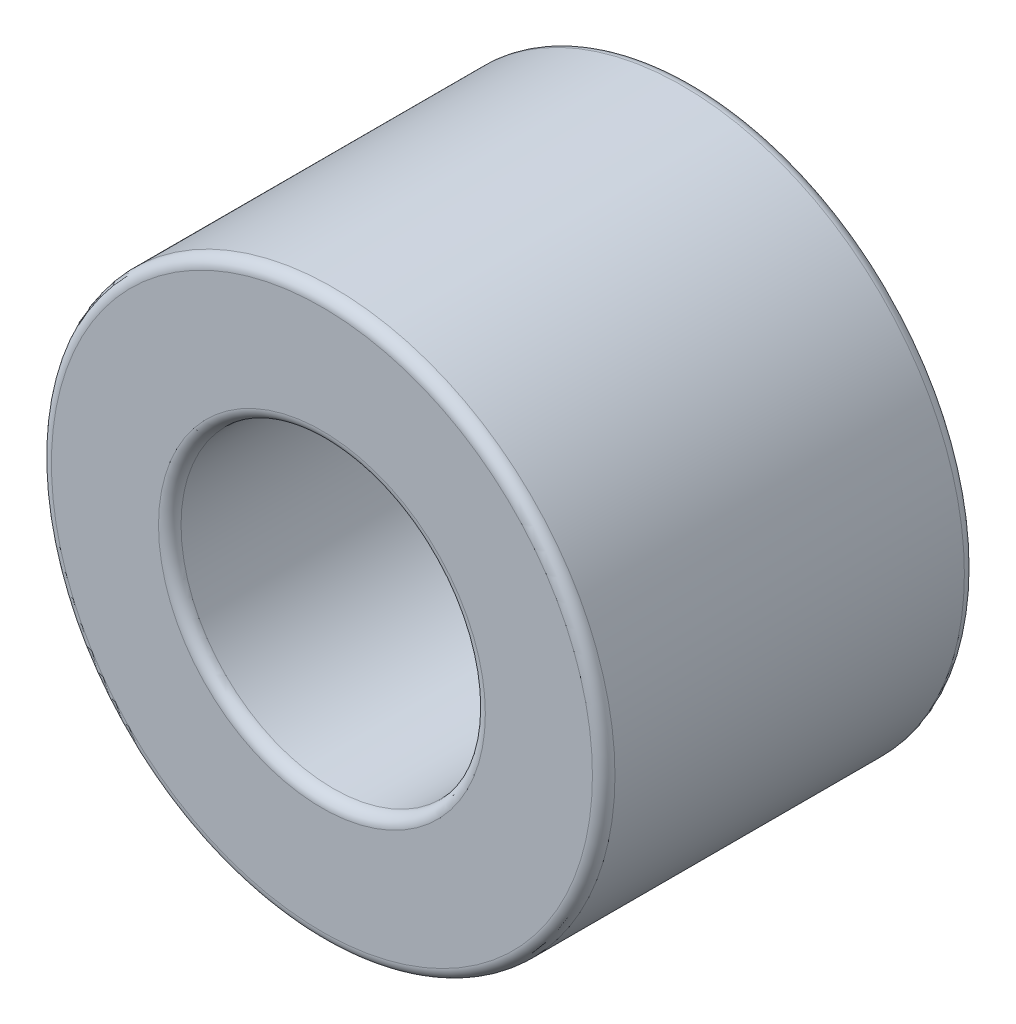
ISO-10303-21;
HEADER;
FILE_DESCRIPTION(('STEP AP214'),'2;1');
FILE_NAME('part.step','',(''),(''),'','','');
FILE_SCHEMA(('AUTOMOTIVE_DESIGN { 1 0 10303 214 1 1 1 1 }'));
ENDSEC;
DATA;
#1=APPLICATION_CONTEXT('core data for automotive mechanical design processes');
#2=APPLICATION_PROTOCOL_DEFINITION('international standard','automotive_design',2000,#1);
#3=PRODUCT_CONTEXT('',#1,'mechanical');
#4=PRODUCT('Part','Part','',(#3));
#5=PRODUCT_RELATED_PRODUCT_CATEGORY('part','',(#4));
#6=PRODUCT_DEFINITION_FORMATION('','',#4);
#7=PRODUCT_DEFINITION_CONTEXT('part definition',#1,'design');
#8=PRODUCT_DEFINITION('design','',#6,#7);
#9=PRODUCT_DEFINITION_SHAPE('','',#8);
#10=(LENGTH_UNIT() NAMED_UNIT(*) SI_UNIT(.MILLI.,.METRE.));
#11=(NAMED_UNIT(*) PLANE_ANGLE_UNIT() SI_UNIT($,.RADIAN.));
#12=(NAMED_UNIT(*) SI_UNIT($,.STERADIAN.) SOLID_ANGLE_UNIT());
#13=UNCERTAINTY_MEASURE_WITH_UNIT(LENGTH_MEASURE(1.E-05),#10,'distance_accuracy_value','');
#14=(GEOMETRIC_REPRESENTATION_CONTEXT(3) GLOBAL_UNCERTAINTY_ASSIGNED_CONTEXT((#13)) GLOBAL_UNIT_ASSIGNED_CONTEXT((#10,
#11,#12)) REPRESENTATION_CONTEXT('',''));
#15=CARTESIAN_POINT('',(0.,0.,0.));
#16=DIRECTION('',(0.,0.,1.));
#17=DIRECTION('',(1.,0.,0.));
#18=AXIS2_PLACEMENT_3D('',#15,#16,#17);
#19=CARTESIAN_POINT('',(0.,0.,4.191));
#20=DIRECTION('',(0.,0.,1.));
#21=DIRECTION('',(1.,0.,0.));
#22=AXIS2_PLACEMENT_3D('',#19,#20,#21);
#23=PLANE('',#22);
#24=CARTESIAN_POINT('',(0.,0.,4.191));
#25=DIRECTION('',(0.,0.,1.));
#26=DIRECTION('',(1.,0.,0.));
#27=AXIS2_PLACEMENT_3D('',#24,#25,#26);
#28=CIRCLE('',#27,3.048);
#29=CARTESIAN_POINT('',(3.048,0.,4.191));
#30=VERTEX_POINT('',#29);
#31=EDGE_CURVE('E10',#30,#30,#28,.T.);
#32=ORIENTED_EDGE('',*,*,#31,.T.);
#33=EDGE_LOOP('',(#32));
#34=FACE_BOUND('',#33,.T.);
#35=CARTESIAN_POINT('',(0.,0.,4.191));
#36=DIRECTION('',(0.,0.,1.));
#37=DIRECTION('',(1.,0.,0.));
#38=AXIS2_PLACEMENT_3D('',#35,#36,#37);
#39=CIRCLE('',#38,1.8415);
#40=CARTESIAN_POINT('',(1.8415,0.,4.191));
#41=VERTEX_POINT('',#40);
#42=EDGE_CURVE('E41',#41,#41,#39,.F.);
#43=ORIENTED_EDGE('',*,*,#42,.T.);
#44=EDGE_LOOP('',(#43));
#45=FACE_BOUND('',#44,.T.);
#46=ADVANCED_FACE('F34',(#34,#45),#23,.T.);
#47=CARTESIAN_POINT('',(0.,0.,0.));
#48=DIRECTION('',(0.,0.,1.));
#49=DIRECTION('',(1.,0.,0.));
#50=AXIS2_PLACEMENT_3D('',#47,#48,#49);
#51=PLANE('',#50);
#52=CARTESIAN_POINT('',(0.,0.,0.));
#53=DIRECTION('',(0.,0.,1.));
#54=DIRECTION('',(1.,0.,0.));
#55=AXIS2_PLACEMENT_3D('',#52,#53,#54);
#56=CIRCLE('',#55,1.8415);
#57=CARTESIAN_POINT('',(1.8415,0.,0.));
#58=VERTEX_POINT('',#57);
#59=EDGE_CURVE('E60',#58,#58,#56,.T.);
#60=ORIENTED_EDGE('',*,*,#59,.T.);
#61=EDGE_LOOP('',(#60));
#62=FACE_BOUND('',#61,.T.);
#63=CARTESIAN_POINT('',(0.,0.,0.));
#64=DIRECTION('',(0.,0.,1.));
#65=DIRECTION('',(1.,0.,0.));
#66=AXIS2_PLACEMENT_3D('',#63,#64,#65);
#67=CIRCLE('',#66,3.048);
#68=CARTESIAN_POINT('',(3.048,0.,0.));
#69=VERTEX_POINT('',#68);
#70=EDGE_CURVE('E63',#69,#69,#67,.F.);
#71=ORIENTED_EDGE('',*,*,#70,.T.);
#72=EDGE_LOOP('',(#71));
#73=FACE_BOUND('',#72,.T.);
#74=ADVANCED_FACE('F67',(#62,#73),#51,.F.);
#75=CARTESIAN_POINT('',(0.,0.,4.191));
#76=DIRECTION('',(0.,0.,-1.));
#77=DIRECTION('',(-1.,0.,0.));
#78=AXIS2_PLACEMENT_3D('',#75,#76,#77);
#79=CYLINDRICAL_SURFACE('',#78,3.175);
#80=CARTESIAN_POINT('',(0.,0.,0.127));
#81=DIRECTION('',(0.,0.,1.));
#82=DIRECTION('',(1.,0.,0.));
#83=AXIS2_PLACEMENT_3D('',#80,#81,#82);
#84=CIRCLE('',#83,3.175);
#85=CARTESIAN_POINT('',(3.175,0.,0.127));
#86=VERTEX_POINT('',#85);
#87=EDGE_CURVE('E45',#86,#86,#84,.T.);
#88=ORIENTED_EDGE('',*,*,#87,.T.);
#89=EDGE_LOOP('',(#88));
#90=FACE_BOUND('',#89,.T.);
#91=CARTESIAN_POINT('',(0.,0.,4.064));
#92=DIRECTION('',(0.,0.,1.));
#93=DIRECTION('',(1.,0.,0.));
#94=AXIS2_PLACEMENT_3D('',#91,#92,#93);
#95=CIRCLE('',#94,3.175);
#96=CARTESIAN_POINT('',(3.175,0.,4.064));
#97=VERTEX_POINT('',#96);
#98=EDGE_CURVE('E49',#97,#97,#95,.F.);
#99=ORIENTED_EDGE('',*,*,#98,.T.);
#100=EDGE_LOOP('',(#99));
#101=FACE_BOUND('',#100,.T.);
#102=ADVANCED_FACE('F77',(#90,#101),#79,.T.);
#103=CARTESIAN_POINT('',(0.,0.,4.191));
#104=DIRECTION('',(0.,0.,-1.));
#105=DIRECTION('',(-1.,0.,0.));
#106=AXIS2_PLACEMENT_3D('',#103,#104,#105);
#107=CYLINDRICAL_SURFACE('',#106,1.7145);
#108=CARTESIAN_POINT('',(0.,0.,0.127));
#109=DIRECTION('',(0.,0.,1.));
#110=DIRECTION('',(1.,0.,0.));
#111=AXIS2_PLACEMENT_3D('',#108,#109,#110);
#112=CIRCLE('',#111,1.7145);
#113=CARTESIAN_POINT('',(1.7145,0.,0.127));
#114=VERTEX_POINT('',#113);
#115=EDGE_CURVE('E54',#114,#114,#112,.F.);
#116=ORIENTED_EDGE('',*,*,#115,.T.);
#117=EDGE_LOOP('',(#116));
#118=FACE_BOUND('',#117,.T.);
#119=CARTESIAN_POINT('',(0.,0.,4.064));
#120=DIRECTION('',(0.,0.,1.));
#121=DIRECTION('',(1.,0.,0.));
#122=AXIS2_PLACEMENT_3D('',#119,#120,#121);
#123=CIRCLE('',#122,1.7145);
#124=CARTESIAN_POINT('',(1.7145,0.,4.064));
#125=VERTEX_POINT('',#124);
#126=EDGE_CURVE('E57',#125,#125,#123,.T.);
#127=ORIENTED_EDGE('',*,*,#126,.T.);
#128=EDGE_LOOP('',(#127));
#129=FACE_BOUND('',#128,.T.);
#130=ADVANCED_FACE('F80',(#118,#129),#107,.F.);
#131=CARTESIAN_POINT('',(0.,0.,0.127));
#132=DIRECTION('',(0.,0.,1.));
#133=DIRECTION('',(1.,0.,0.));
#134=AXIS2_PLACEMENT_3D('',#131,#132,#133);
#135=TOROIDAL_SURFACE('',#134,1.8415,0.127);
#136=ORIENTED_EDGE('',*,*,#115,.F.);
#137=EDGE_LOOP('',(#136));
#138=FACE_BOUND('',#137,.T.);
#139=ORIENTED_EDGE('',*,*,#59,.F.);
#140=EDGE_LOOP('',(#139));
#141=FACE_BOUND('',#140,.T.);
#142=ADVANCED_FACE('F73',(#138,#141),#135,.T.);
#143=CARTESIAN_POINT('',(0.,0.,0.127));
#144=DIRECTION('',(0.,0.,1.));
#145=DIRECTION('',(1.,0.,0.));
#146=AXIS2_PLACEMENT_3D('',#143,#144,#145);
#147=TOROIDAL_SURFACE('',#146,3.048,0.127);
#148=ORIENTED_EDGE('',*,*,#70,.F.);
#149=EDGE_LOOP('',(#148));
#150=FACE_BOUND('',#149,.T.);
#151=ORIENTED_EDGE('',*,*,#87,.F.);
#152=EDGE_LOOP('',(#151));
#153=FACE_BOUND('',#152,.T.);
#154=ADVANCED_FACE('F69',(#150,#153),#147,.T.);
#155=CARTESIAN_POINT('',(0.,0.,4.064));
#156=DIRECTION('',(0.,0.,1.));
#157=DIRECTION('',(1.,0.,0.));
#158=AXIS2_PLACEMENT_3D('',#155,#156,#157);
#159=TOROIDAL_SURFACE('',#158,3.048,0.127);
#160=ORIENTED_EDGE('',*,*,#98,.F.);
#161=EDGE_LOOP('',(#160));
#162=FACE_BOUND('',#161,.T.);
#163=ORIENTED_EDGE('',*,*,#31,.F.);
#164=EDGE_LOOP('',(#163));
#165=FACE_BOUND('',#164,.T.);
#166=ADVANCED_FACE('F72',(#162,#165),#159,.T.);
#167=CARTESIAN_POINT('',(0.,0.,4.064));
#168=DIRECTION('',(0.,0.,1.));
#169=DIRECTION('',(1.,0.,0.));
#170=AXIS2_PLACEMENT_3D('',#167,#168,#169);
#171=TOROIDAL_SURFACE('',#170,1.8415,0.127);
#172=ORIENTED_EDGE('',*,*,#42,.F.);
#173=EDGE_LOOP('',(#172));
#174=FACE_BOUND('',#173,.T.);
#175=ORIENTED_EDGE('',*,*,#126,.F.);
#176=EDGE_LOOP('',(#175));
#177=FACE_BOUND('',#176,.T.);
#178=ADVANCED_FACE('F36',(#174,#177),#171,.T.);
#179=CLOSED_SHELL('',(#46,#74,#102,#130,#142,#154,#166,#178));
#180=MANIFOLD_SOLID_BREP('B2',#179);
#181=ADVANCED_BREP_SHAPE_REPRESENTATION('',(#18,#180),#14);
#182=SHAPE_DEFINITION_REPRESENTATION(#9,#181);
ENDSEC;
END-ISO-10303-21;
